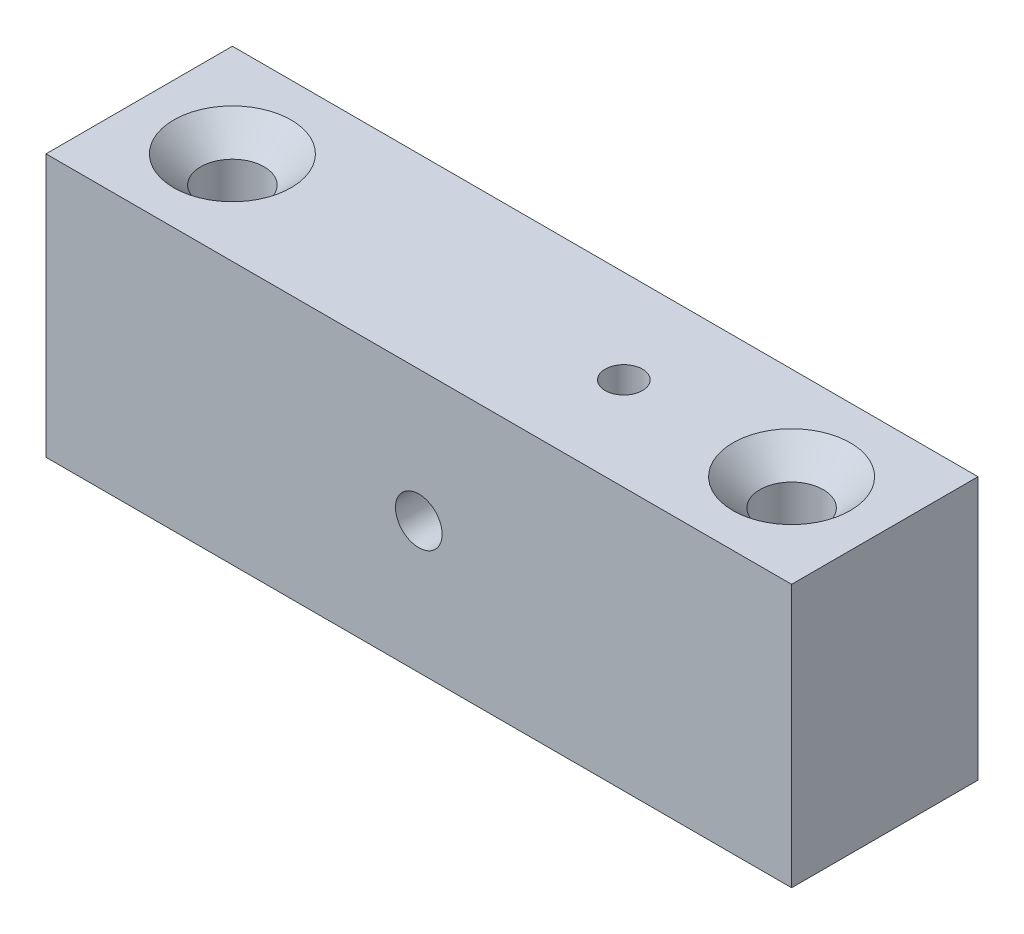
ISO-10303-21;
HEADER;
FILE_DESCRIPTION(('STEP AP214'),'2;1');
FILE_NAME('part.step','',(''),(''),'','','');
FILE_SCHEMA(('AUTOMOTIVE_DESIGN { 1 0 10303 214 1 1 1 1 }'));
ENDSEC;
DATA;
#1=APPLICATION_CONTEXT('core data for automotive mechanical design processes');
#2=APPLICATION_PROTOCOL_DEFINITION('international standard','automotive_design',2000,#1);
#3=PRODUCT_CONTEXT('',#1,'mechanical');
#4=PRODUCT('Part','Part','',(#3));
#5=PRODUCT_RELATED_PRODUCT_CATEGORY('part','',(#4));
#6=PRODUCT_DEFINITION_FORMATION('','',#4);
#7=PRODUCT_DEFINITION_CONTEXT('part definition',#1,'design');
#8=PRODUCT_DEFINITION('design','',#6,#7);
#9=PRODUCT_DEFINITION_SHAPE('','',#8);
#10=(LENGTH_UNIT() NAMED_UNIT(*) SI_UNIT(.MILLI.,.METRE.));
#11=(NAMED_UNIT(*) PLANE_ANGLE_UNIT() SI_UNIT($,.RADIAN.));
#12=(NAMED_UNIT(*) SI_UNIT($,.STERADIAN.) SOLID_ANGLE_UNIT());
#13=UNCERTAINTY_MEASURE_WITH_UNIT(LENGTH_MEASURE(1.E-05),#10,'distance_accuracy_value','');
#14=(GEOMETRIC_REPRESENTATION_CONTEXT(3) GLOBAL_UNCERTAINTY_ASSIGNED_CONTEXT((#13)) GLOBAL_UNIT_ASSIGNED_CONTEXT((#10,
#11,#12)) REPRESENTATION_CONTEXT('',''));
#15=CARTESIAN_POINT('',(0.,0.,0.));
#16=DIRECTION('',(0.,0.,1.));
#17=DIRECTION('',(1.,0.,0.));
#18=AXIS2_PLACEMENT_3D('',#15,#16,#17);
#19=CARTESIAN_POINT('',(0.,0.,0.));
#20=DIRECTION('',(0.,-1.,0.));
#21=DIRECTION('',(0.,0.,-1.));
#22=AXIS2_PLACEMENT_3D('',#19,#20,#21);
#23=PLANE('',#22);
#24=CARTESIAN_POINT('',(26.,0.,-5.));
#25=DIRECTION('',(0.,1.,0.));
#26=DIRECTION('',(0.,0.,1.));
#27=AXIS2_PLACEMENT_3D('',#24,#25,#26);
#28=CIRCLE('',#27,0.999999999999997);
#29=CARTESIAN_POINT('',(26.,0.,-4.));
#30=VERTEX_POINT('',#29);
#31=EDGE_CURVE('E135',#30,#30,#28,.T.);
#32=ORIENTED_EDGE('',*,*,#31,.T.);
#33=EDGE_LOOP('',(#32));
#34=FACE_BOUND('',#33,.T.);
#35=DIRECTION('',(0.,0.,1.));
#36=VECTOR('',#35,1.);
#37=CARTESIAN_POINT('',(0.,0.,0.));
#38=LINE('',#37,#36);
#39=CARTESIAN_POINT('',(0.,0.,-10.));
#40=VERTEX_POINT('',#39);
#41=CARTESIAN_POINT('',(0.,0.,0.));
#42=VERTEX_POINT('',#41);
#43=EDGE_CURVE('E98',#40,#42,#38,.T.);
#44=ORIENTED_EDGE('',*,*,#43,.F.);
#45=DIRECTION('',(-1.,0.,0.));
#46=VECTOR('',#45,1.);
#47=CARTESIAN_POINT('',(0.,0.,-10.));
#48=LINE('',#47,#46);
#49=CARTESIAN_POINT('',(40.,0.,-10.));
#50=VERTEX_POINT('',#49);
#51=EDGE_CURVE('E74',#50,#40,#48,.T.);
#52=ORIENTED_EDGE('',*,*,#51,.F.);
#53=DIRECTION('',(0.,0.,-1.));
#54=VECTOR('',#53,1.);
#55=CARTESIAN_POINT('',(40.,0.,0.));
#56=LINE('',#55,#54);
#57=CARTESIAN_POINT('',(40.,0.,0.));
#58=VERTEX_POINT('',#57);
#59=EDGE_CURVE('E68',#58,#50,#56,.T.);
#60=ORIENTED_EDGE('',*,*,#59,.F.);
#61=DIRECTION('',(1.,0.,0.));
#62=VECTOR('',#61,1.);
#63=CARTESIAN_POINT('',(0.,0.,0.));
#64=LINE('',#63,#62);
#65=EDGE_CURVE('E90',#42,#58,#64,.T.);
#66=ORIENTED_EDGE('',*,*,#65,.F.);
#67=EDGE_LOOP('',(#44,#52,#60,#66));
#68=FACE_BOUND('',#67,.T.);
#69=CARTESIAN_POINT('',(35.,0.,-5.));
#70=DIRECTION('',(0.,1.,0.));
#71=DIRECTION('',(0.,0.,1.));
#72=AXIS2_PLACEMENT_3D('',#69,#70,#71);
#73=CIRCLE('',#72,1.7);
#74=CARTESIAN_POINT('',(35.,0.,-3.3));
#75=VERTEX_POINT('',#74);
#76=EDGE_CURVE('E101',#75,#75,#73,.T.);
#77=ORIENTED_EDGE('',*,*,#76,.T.);
#78=EDGE_LOOP('',(#77));
#79=FACE_BOUND('',#78,.T.);
#80=CARTESIAN_POINT('',(5.,0.,-5.));
#81=DIRECTION('',(0.,1.,0.));
#82=DIRECTION('',(0.,0.,1.));
#83=AXIS2_PLACEMENT_3D('',#80,#81,#82);
#84=CIRCLE('',#83,1.7);
#85=CARTESIAN_POINT('',(5.,0.,-3.3));
#86=VERTEX_POINT('',#85);
#87=EDGE_CURVE('E120',#86,#86,#84,.T.);
#88=ORIENTED_EDGE('',*,*,#87,.T.);
#89=EDGE_LOOP('',(#88));
#90=FACE_BOUND('',#89,.T.);
#91=ADVANCED_FACE('F34',(#34,#68,#79,#90),#23,.T.);
#92=CARTESIAN_POINT('',(0.,14.1,0.));
#93=DIRECTION('',(1.,0.,0.));
#94=DIRECTION('',(0.,0.,-1.));
#95=AXIS2_PLACEMENT_3D('',#92,#93,#94);
#96=PLANE('',#95);
#97=ORIENTED_EDGE('',*,*,#43,.T.);
#98=DIRECTION('',(0.,-1.,0.));
#99=VECTOR('',#98,1.);
#100=CARTESIAN_POINT('',(0.,14.1,0.));
#101=LINE('',#100,#99);
#102=CARTESIAN_POINT('',(0.,14.1,0.));
#103=VERTEX_POINT('',#102);
#104=EDGE_CURVE('E11',#103,#42,#101,.T.);
#105=ORIENTED_EDGE('',*,*,#104,.F.);
#106=DIRECTION('',(0.,0.,1.));
#107=VECTOR('',#106,1.);
#108=CARTESIAN_POINT('',(0.,14.1,0.));
#109=LINE('',#108,#107);
#110=CARTESIAN_POINT('',(0.,14.1,-10.));
#111=VERTEX_POINT('',#110);
#112=EDGE_CURVE('E86',#111,#103,#109,.T.);
#113=ORIENTED_EDGE('',*,*,#112,.F.);
#114=DIRECTION('',(0.,-1.,0.));
#115=VECTOR('',#114,1.);
#116=CARTESIAN_POINT('',(0.,14.1,-10.));
#117=LINE('',#116,#115);
#118=EDGE_CURVE('E94',#111,#40,#117,.T.);
#119=ORIENTED_EDGE('',*,*,#118,.T.);
#120=EDGE_LOOP('',(#97,#105,#113,#119));
#121=FACE_BOUND('',#120,.T.);
#122=ADVANCED_FACE('F36',(#121),#96,.F.);
#123=CARTESIAN_POINT('',(0.,14.1,0.));
#124=DIRECTION('',(0.,0.,-1.));
#125=DIRECTION('',(-1.,0.,0.));
#126=AXIS2_PLACEMENT_3D('',#123,#124,#125);
#127=PLANE('',#126);
#128=CARTESIAN_POINT('',(20.,7.05,0.));
#129=DIRECTION('',(0.,0.,-1.));
#130=DIRECTION('',(-1.,0.,0.));
#131=AXIS2_PLACEMENT_3D('',#128,#129,#130);
#132=CIRCLE('',#131,1.25);
#133=CARTESIAN_POINT('',(18.75,7.05,0.));
#134=VERTEX_POINT('',#133);
#135=EDGE_CURVE('E129',#134,#134,#132,.T.);
#136=ORIENTED_EDGE('',*,*,#135,.T.);
#137=EDGE_LOOP('',(#136));
#138=FACE_BOUND('',#137,.T.);
#139=ORIENTED_EDGE('',*,*,#65,.T.);
#140=DIRECTION('',(0.,-1.,0.));
#141=VECTOR('',#140,1.);
#142=CARTESIAN_POINT('',(40.,14.1,0.));
#143=LINE('',#142,#141);
#144=CARTESIAN_POINT('',(40.,14.1,0.));
#145=VERTEX_POINT('',#144);
#146=EDGE_CURVE('E43',#145,#58,#143,.T.);
#147=ORIENTED_EDGE('',*,*,#146,.F.);
#148=DIRECTION('',(1.,0.,0.));
#149=VECTOR('',#148,1.);
#150=CARTESIAN_POINT('',(0.,14.1,0.));
#151=LINE('',#150,#149);
#152=EDGE_CURVE('E81',#103,#145,#151,.T.);
#153=ORIENTED_EDGE('',*,*,#152,.F.);
#154=ORIENTED_EDGE('',*,*,#104,.T.);
#155=EDGE_LOOP('',(#139,#147,#153,#154));
#156=FACE_BOUND('',#155,.T.);
#157=ADVANCED_FACE('F89',(#138,#156),#127,.F.);
#158=CARTESIAN_POINT('',(40.,14.1,0.));
#159=DIRECTION('',(-1.,0.,0.));
#160=DIRECTION('',(0.,0.,1.));
#161=AXIS2_PLACEMENT_3D('',#158,#159,#160);
#162=PLANE('',#161);
#163=ORIENTED_EDGE('',*,*,#59,.T.);
#164=DIRECTION('',(0.,-1.,0.));
#165=VECTOR('',#164,1.);
#166=CARTESIAN_POINT('',(40.,14.1,-10.));
#167=LINE('',#166,#165);
#168=CARTESIAN_POINT('',(40.,14.1,-10.));
#169=VERTEX_POINT('',#168);
#170=EDGE_CURVE('E91',#169,#50,#167,.T.);
#171=ORIENTED_EDGE('',*,*,#170,.F.);
#172=DIRECTION('',(0.,0.,-1.));
#173=VECTOR('',#172,1.);
#174=CARTESIAN_POINT('',(40.,14.1,0.));
#175=LINE('',#174,#173);
#176=EDGE_CURVE('E84',#145,#169,#175,.T.);
#177=ORIENTED_EDGE('',*,*,#176,.F.);
#178=ORIENTED_EDGE('',*,*,#146,.T.);
#179=EDGE_LOOP('',(#163,#171,#177,#178));
#180=FACE_BOUND('',#179,.T.);
#181=ADVANCED_FACE('F92',(#180),#162,.F.);
#182=CARTESIAN_POINT('',(0.,14.1,-10.));
#183=DIRECTION('',(0.,0.,1.));
#184=DIRECTION('',(1.,0.,0.));
#185=AXIS2_PLACEMENT_3D('',#182,#183,#184);
#186=PLANE('',#185);
#187=CARTESIAN_POINT('',(20.,7.05,-10.));
#188=DIRECTION('',(0.,0.,-1.));
#189=DIRECTION('',(-1.,0.,0.));
#190=AXIS2_PLACEMENT_3D('',#187,#188,#189);
#191=CIRCLE('',#190,1.25);
#192=CARTESIAN_POINT('',(18.75,7.05,-10.));
#193=VERTEX_POINT('',#192);
#194=EDGE_CURVE('E132',#193,#193,#191,.T.);
#195=ORIENTED_EDGE('',*,*,#194,.F.);
#196=EDGE_LOOP('',(#195));
#197=FACE_BOUND('',#196,.T.);
#198=ORIENTED_EDGE('',*,*,#51,.T.);
#199=ORIENTED_EDGE('',*,*,#118,.F.);
#200=DIRECTION('',(-1.,0.,0.));
#201=VECTOR('',#200,1.);
#202=CARTESIAN_POINT('',(0.,14.1,-10.));
#203=LINE('',#202,#201);
#204=EDGE_CURVE('E51',#169,#111,#203,.T.);
#205=ORIENTED_EDGE('',*,*,#204,.F.);
#206=ORIENTED_EDGE('',*,*,#170,.T.);
#207=EDGE_LOOP('',(#198,#199,#205,#206));
#208=FACE_BOUND('',#207,.T.);
#209=ADVANCED_FACE('F106',(#197,#208),#186,.F.);
#210=CARTESIAN_POINT('',(0.,14.1,0.));
#211=DIRECTION('',(0.,-1.,0.));
#212=DIRECTION('',(0.,0.,-1.));
#213=AXIS2_PLACEMENT_3D('',#210,#211,#212);
#214=PLANE('',#213);
#215=CARTESIAN_POINT('',(26.,14.1,-5.));
#216=DIRECTION('',(0.,1.,0.));
#217=DIRECTION('',(0.,0.,1.));
#218=AXIS2_PLACEMENT_3D('',#215,#216,#217);
#219=CIRCLE('',#218,0.999999999999997);
#220=CARTESIAN_POINT('',(26.,14.1,-4.));
#221=VERTEX_POINT('',#220);
#222=EDGE_CURVE('E138',#221,#221,#219,.T.);
#223=ORIENTED_EDGE('',*,*,#222,.F.);
#224=EDGE_LOOP('',(#223));
#225=FACE_BOUND('',#224,.T.);
#226=CARTESIAN_POINT('',(5.,14.1,-5.));
#227=DIRECTION('',(0.,1.,0.));
#228=DIRECTION('',(0.,0.,1.));
#229=AXIS2_PLACEMENT_3D('',#226,#227,#228);
#230=CIRCLE('',#229,3.15);
#231=CARTESIAN_POINT('',(5.,14.1,-1.85));
#232=VERTEX_POINT('',#231);
#233=EDGE_CURVE('E126',#232,#232,#230,.T.);
#234=ORIENTED_EDGE('',*,*,#233,.F.);
#235=EDGE_LOOP('',(#234));
#236=FACE_BOUND('',#235,.T.);
#237=CARTESIAN_POINT('',(35.,14.1,-5.));
#238=DIRECTION('',(0.,1.,0.));
#239=DIRECTION('',(0.,0.,1.));
#240=AXIS2_PLACEMENT_3D('',#237,#238,#239);
#241=CIRCLE('',#240,3.15);
#242=CARTESIAN_POINT('',(35.,14.1,-1.85));
#243=VERTEX_POINT('',#242);
#244=EDGE_CURVE('E117',#243,#243,#241,.T.);
#245=ORIENTED_EDGE('',*,*,#244,.F.);
#246=EDGE_LOOP('',(#245));
#247=FACE_BOUND('',#246,.T.);
#248=ORIENTED_EDGE('',*,*,#112,.T.);
#249=ORIENTED_EDGE('',*,*,#152,.T.);
#250=ORIENTED_EDGE('',*,*,#176,.T.);
#251=ORIENTED_EDGE('',*,*,#204,.T.);
#252=EDGE_LOOP('',(#248,#249,#250,#251));
#253=FACE_BOUND('',#252,.T.);
#254=ADVANCED_FACE('F82',(#225,#236,#247,#253),#214,.F.);
#255=CARTESIAN_POINT('',(35.,14.1,-5.));
#256=DIRECTION('',(0.,1.,0.));
#257=DIRECTION('',(0.,0.,1.));
#258=AXIS2_PLACEMENT_3D('',#255,#256,#257);
#259=CYLINDRICAL_SURFACE('',#258,1.7);
#260=ORIENTED_EDGE('',*,*,#76,.F.);
#261=EDGE_LOOP('',(#260));
#262=FACE_BOUND('',#261,.T.);
#263=CARTESIAN_POINT('',(35.,12.65,-5.));
#264=DIRECTION('',(0.,1.,0.));
#265=DIRECTION('',(0.,0.,1.));
#266=AXIS2_PLACEMENT_3D('',#263,#264,#265);
#267=CIRCLE('',#266,1.7);
#268=CARTESIAN_POINT('',(35.,12.65,-3.3));
#269=VERTEX_POINT('',#268);
#270=EDGE_CURVE('E114',#269,#269,#267,.T.);
#271=ORIENTED_EDGE('',*,*,#270,.T.);
#272=EDGE_LOOP('',(#271));
#273=FACE_BOUND('',#272,.T.);
#274=ADVANCED_FACE('F146',(#262,#273),#259,.F.);
#275=CARTESIAN_POINT('',(35.,14.1,-5.));
#276=DIRECTION('',(0.,1.,0.));
#277=DIRECTION('',(0.,0.,1.));
#278=AXIS2_PLACEMENT_3D('',#275,#276,#277);
#279=CONICAL_SURFACE('',#278,3.15,0.785398163397447);
#280=ORIENTED_EDGE('',*,*,#270,.F.);
#281=EDGE_LOOP('',(#280));
#282=FACE_BOUND('',#281,.T.);
#283=ORIENTED_EDGE('',*,*,#244,.T.);
#284=EDGE_LOOP('',(#283));
#285=FACE_BOUND('',#284,.T.);
#286=ADVANCED_FACE('F152',(#282,#285),#279,.F.);
#287=CARTESIAN_POINT('',(5.,14.1,-5.));
#288=DIRECTION('',(0.,1.,0.));
#289=DIRECTION('',(0.,0.,1.));
#290=AXIS2_PLACEMENT_3D('',#287,#288,#289);
#291=CYLINDRICAL_SURFACE('',#290,1.7);
#292=ORIENTED_EDGE('',*,*,#87,.F.);
#293=EDGE_LOOP('',(#292));
#294=FACE_BOUND('',#293,.T.);
#295=CARTESIAN_POINT('',(5.,12.65,-5.));
#296=DIRECTION('',(0.,1.,0.));
#297=DIRECTION('',(0.,0.,1.));
#298=AXIS2_PLACEMENT_3D('',#295,#296,#297);
#299=CIRCLE('',#298,1.7);
#300=CARTESIAN_POINT('',(5.,12.65,-3.3));
#301=VERTEX_POINT('',#300);
#302=EDGE_CURVE('E123',#301,#301,#299,.T.);
#303=ORIENTED_EDGE('',*,*,#302,.T.);
#304=EDGE_LOOP('',(#303));
#305=FACE_BOUND('',#304,.T.);
#306=ADVANCED_FACE('F154',(#294,#305),#291,.F.);
#307=CARTESIAN_POINT('',(5.,14.1,-5.));
#308=DIRECTION('',(0.,1.,0.));
#309=DIRECTION('',(0.,0.,1.));
#310=AXIS2_PLACEMENT_3D('',#307,#308,#309);
#311=CONICAL_SURFACE('',#310,3.15,0.785398163397448);
#312=ORIENTED_EDGE('',*,*,#302,.F.);
#313=EDGE_LOOP('',(#312));
#314=FACE_BOUND('',#313,.T.);
#315=ORIENTED_EDGE('',*,*,#233,.T.);
#316=EDGE_LOOP('',(#315));
#317=FACE_BOUND('',#316,.T.);
#318=ADVANCED_FACE('F161',(#314,#317),#311,.F.);
#319=CARTESIAN_POINT('',(20.,7.05,-10.));
#320=DIRECTION('',(0.,0.,-1.));
#321=DIRECTION('',(-1.,0.,0.));
#322=AXIS2_PLACEMENT_3D('',#319,#320,#321);
#323=CYLINDRICAL_SURFACE('',#322,1.25);
#324=ORIENTED_EDGE('',*,*,#135,.F.);
#325=EDGE_LOOP('',(#324));
#326=FACE_BOUND('',#325,.T.);
#327=ORIENTED_EDGE('',*,*,#194,.T.);
#328=EDGE_LOOP('',(#327));
#329=FACE_BOUND('',#328,.T.);
#330=ADVANCED_FACE('F184',(#326,#329),#323,.F.);
#331=CARTESIAN_POINT('',(26.,14.1,-5.));
#332=DIRECTION('',(0.,1.,0.));
#333=DIRECTION('',(0.,0.,1.));
#334=AXIS2_PLACEMENT_3D('',#331,#332,#333);
#335=CYLINDRICAL_SURFACE('',#334,0.999999999999997);
#336=ORIENTED_EDGE('',*,*,#31,.F.);
#337=EDGE_LOOP('',(#336));
#338=FACE_BOUND('',#337,.T.);
#339=ORIENTED_EDGE('',*,*,#222,.T.);
#340=EDGE_LOOP('',(#339));
#341=FACE_BOUND('',#340,.T.);
#342=ADVANCED_FACE('F142',(#338,#341),#335,.F.);
#343=CLOSED_SHELL('',(#91,#122,#157,#181,#209,#254,#274,#286,#306,#318,#330,#342));
#344=MANIFOLD_SOLID_BREP('B2',#343);
#345=ADVANCED_BREP_SHAPE_REPRESENTATION('',(#18,#344),#14);
#346=SHAPE_DEFINITION_REPRESENTATION(#9,#345);
ENDSEC;
END-ISO-10303-21;
